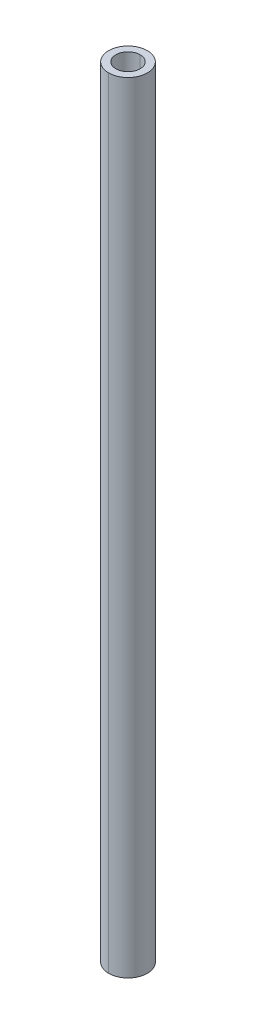
ISO-10303-21;
HEADER;
FILE_DESCRIPTION(('STEP AP214'),'2;1');
FILE_NAME('part.step','',(''),(''),'','','');
FILE_SCHEMA(('AUTOMOTIVE_DESIGN { 1 0 10303 214 1 1 1 1 }'));
ENDSEC;
DATA;
#1=APPLICATION_CONTEXT('core data for automotive mechanical design processes');
#2=APPLICATION_PROTOCOL_DEFINITION('international standard','automotive_design',2000,#1);
#3=PRODUCT_CONTEXT('',#1,'mechanical');
#4=PRODUCT('Part','Part','',(#3));
#5=PRODUCT_RELATED_PRODUCT_CATEGORY('part','',(#4));
#6=PRODUCT_DEFINITION_FORMATION('','',#4);
#7=PRODUCT_DEFINITION_CONTEXT('part definition',#1,'design');
#8=PRODUCT_DEFINITION('design','',#6,#7);
#9=PRODUCT_DEFINITION_SHAPE('','',#8);
#10=(LENGTH_UNIT() NAMED_UNIT(*) SI_UNIT(.MILLI.,.METRE.));
#11=(NAMED_UNIT(*) PLANE_ANGLE_UNIT() SI_UNIT($,.RADIAN.));
#12=(NAMED_UNIT(*) SI_UNIT($,.STERADIAN.) SOLID_ANGLE_UNIT());
#13=UNCERTAINTY_MEASURE_WITH_UNIT(LENGTH_MEASURE(1.E-05),#10,'distance_accuracy_value','');
#14=(GEOMETRIC_REPRESENTATION_CONTEXT(3) GLOBAL_UNCERTAINTY_ASSIGNED_CONTEXT((#13)) GLOBAL_UNIT_ASSIGNED_CONTEXT((#10,
#11,#12)) REPRESENTATION_CONTEXT('',''));
#15=CARTESIAN_POINT('',(0.,0.,0.));
#16=DIRECTION('',(0.,0.,1.));
#17=DIRECTION('',(1.,0.,0.));
#18=AXIS2_PLACEMENT_3D('',#15,#16,#17);
#19=CARTESIAN_POINT('',(0.,120.,0.));
#20=DIRECTION('',(0.,-1.,0.));
#21=DIRECTION('',(0.,0.,-1.));
#22=AXIS2_PLACEMENT_3D('',#19,#20,#21);
#23=CYLINDRICAL_SURFACE('',#22,1.875);
#24=DIRECTION('',(0.,-1.,0.));
#25=VECTOR('',#24,1.);
#26=CARTESIAN_POINT('',(0.,120.,1.875));
#27=LINE('',#26,#25);
#28=CARTESIAN_POINT('',(0.,120.,1.875));
#29=VERTEX_POINT('',#28);
#30=CARTESIAN_POINT('',(0.,0.,1.875));
#31=VERTEX_POINT('',#30);
#32=EDGE_CURVE('E83',#29,#31,#27,.T.);
#33=ORIENTED_EDGE('',*,*,#32,.F.);
#34=CARTESIAN_POINT('',(0.,120.,0.));
#35=DIRECTION('',(0.,1.,0.));
#36=DIRECTION('',(0.,0.,1.));
#37=AXIS2_PLACEMENT_3D('',#34,#35,#36);
#38=CIRCLE('',#37,1.875);
#39=CARTESIAN_POINT('',(0.,120.,-1.875));
#40=VERTEX_POINT('',#39);
#41=EDGE_CURVE('E73',#29,#40,#38,.T.);
#42=ORIENTED_EDGE('',*,*,#41,.T.);
#43=DIRECTION('',(0.,-1.,0.));
#44=VECTOR('',#43,1.);
#45=CARTESIAN_POINT('',(0.,120.,-1.875));
#46=LINE('',#45,#44);
#47=CARTESIAN_POINT('',(0.,0.,-1.875));
#48=VERTEX_POINT('',#47);
#49=EDGE_CURVE('E86',#40,#48,#46,.T.);
#50=ORIENTED_EDGE('',*,*,#49,.T.);
#51=CARTESIAN_POINT('',(0.,0.,0.));
#52=DIRECTION('',(0.,1.,0.));
#53=DIRECTION('',(0.,0.,1.));
#54=AXIS2_PLACEMENT_3D('',#51,#52,#53);
#55=CIRCLE('',#54,1.875);
#56=EDGE_CURVE('E11',#31,#48,#55,.T.);
#57=ORIENTED_EDGE('',*,*,#56,.F.);
#58=EDGE_LOOP('',(#33,#42,#50,#57));
#59=FACE_BOUND('',#58,.T.);
#60=ADVANCED_FACE('F19',(#59),#23,.F.);
#61=CARTESIAN_POINT('',(0.,120.,0.));
#62=DIRECTION('',(0.,-1.,0.));
#63=DIRECTION('',(0.,0.,-1.));
#64=AXIS2_PLACEMENT_3D('',#61,#62,#63);
#65=CYLINDRICAL_SURFACE('',#64,2.975);
#66=DIRECTION('',(0.,-1.,0.));
#67=VECTOR('',#66,1.);
#68=CARTESIAN_POINT('',(0.,120.,2.975));
#69=LINE('',#68,#67);
#70=CARTESIAN_POINT('',(0.,120.,2.975));
#71=VERTEX_POINT('',#70);
#72=CARTESIAN_POINT('',(0.,0.,2.975));
#73=VERTEX_POINT('',#72);
#74=EDGE_CURVE('E107',#71,#73,#69,.T.);
#75=ORIENTED_EDGE('',*,*,#74,.F.);
#76=CARTESIAN_POINT('',(0.,120.,0.));
#77=DIRECTION('',(0.,1.,0.));
#78=DIRECTION('',(0.,0.,1.));
#79=AXIS2_PLACEMENT_3D('',#76,#77,#78);
#80=CIRCLE('',#79,2.975);
#81=CARTESIAN_POINT('',(0.,120.,-2.975));
#82=VERTEX_POINT('',#81);
#83=EDGE_CURVE('E112',#82,#71,#80,.T.);
#84=ORIENTED_EDGE('',*,*,#83,.F.);
#85=DIRECTION('',(0.,-1.,0.));
#86=VECTOR('',#85,1.);
#87=CARTESIAN_POINT('',(0.,120.,-2.975));
#88=LINE('',#87,#86);
#89=CARTESIAN_POINT('',(0.,0.,-2.975));
#90=VERTEX_POINT('',#89);
#91=EDGE_CURVE('E117',#82,#90,#88,.T.);
#92=ORIENTED_EDGE('',*,*,#91,.T.);
#93=CARTESIAN_POINT('',(0.,0.,0.));
#94=DIRECTION('',(0.,1.,0.));
#95=DIRECTION('',(0.,0.,1.));
#96=AXIS2_PLACEMENT_3D('',#93,#94,#95);
#97=CIRCLE('',#96,2.975);
#98=EDGE_CURVE('E29',#90,#73,#97,.T.);
#99=ORIENTED_EDGE('',*,*,#98,.T.);
#100=EDGE_LOOP('',(#75,#84,#92,#99));
#101=FACE_BOUND('',#100,.T.);
#102=ADVANCED_FACE('F128',(#101),#65,.T.);
#103=CARTESIAN_POINT('',(0.,0.,0.));
#104=DIRECTION('',(0.,1.,0.));
#105=DIRECTION('',(1.,0.,0.));
#106=AXIS2_PLACEMENT_3D('',#103,#104,#105);
#107=PLANE('',#106);
#108=CARTESIAN_POINT('',(0.,0.,0.));
#109=DIRECTION('',(0.,1.,0.));
#110=DIRECTION('',(0.,0.,1.));
#111=AXIS2_PLACEMENT_3D('',#108,#109,#110);
#112=CIRCLE('',#111,1.875);
#113=EDGE_CURVE('E89',#48,#31,#112,.T.);
#114=ORIENTED_EDGE('',*,*,#113,.T.);
#115=ORIENTED_EDGE('',*,*,#56,.T.);
#116=EDGE_LOOP('',(#114,#115));
#117=FACE_BOUND('',#116,.T.);
#118=ORIENTED_EDGE('',*,*,#98,.F.);
#119=CARTESIAN_POINT('',(0.,0.,0.));
#120=DIRECTION('',(0.,1.,0.));
#121=DIRECTION('',(0.,0.,1.));
#122=AXIS2_PLACEMENT_3D('',#119,#120,#121);
#123=CIRCLE('',#122,2.975);
#124=EDGE_CURVE('E121',#73,#90,#123,.T.);
#125=ORIENTED_EDGE('',*,*,#124,.F.);
#126=EDGE_LOOP('',(#118,#125));
#127=FACE_BOUND('',#126,.T.);
#128=ADVANCED_FACE('F90',(#117,#127),#107,.F.);
#129=CARTESIAN_POINT('',(0.,120.,0.));
#130=DIRECTION('',(0.,1.,0.));
#131=DIRECTION('',(1.,0.,0.));
#132=AXIS2_PLACEMENT_3D('',#129,#130,#131);
#133=PLANE('',#132);
#134=CARTESIAN_POINT('',(0.,120.,0.));
#135=DIRECTION('',(0.,1.,0.));
#136=DIRECTION('',(0.,0.,1.));
#137=AXIS2_PLACEMENT_3D('',#134,#135,#136);
#138=CIRCLE('',#137,1.875);
#139=EDGE_CURVE('E23',#40,#29,#138,.T.);
#140=ORIENTED_EDGE('',*,*,#139,.F.);
#141=ORIENTED_EDGE('',*,*,#41,.F.);
#142=EDGE_LOOP('',(#140,#141));
#143=FACE_BOUND('',#142,.T.);
#144=ORIENTED_EDGE('',*,*,#83,.T.);
#145=CARTESIAN_POINT('',(0.,120.,0.));
#146=DIRECTION('',(0.,1.,0.));
#147=DIRECTION('',(0.,0.,1.));
#148=AXIS2_PLACEMENT_3D('',#145,#146,#147);
#149=CIRCLE('',#148,2.975);
#150=EDGE_CURVE('E104',#71,#82,#149,.T.);
#151=ORIENTED_EDGE('',*,*,#150,.T.);
#152=EDGE_LOOP('',(#144,#151));
#153=FACE_BOUND('',#152,.T.);
#154=ADVANCED_FACE('F21',(#143,#153),#133,.T.);
#155=CARTESIAN_POINT('',(0.,120.,0.));
#156=DIRECTION('',(0.,-1.,0.));
#157=DIRECTION('',(0.,0.,-1.));
#158=AXIS2_PLACEMENT_3D('',#155,#156,#157);
#159=CYLINDRICAL_SURFACE('',#158,2.975);
#160=ORIENTED_EDGE('',*,*,#150,.F.);
#161=ORIENTED_EDGE('',*,*,#74,.T.);
#162=ORIENTED_EDGE('',*,*,#124,.T.);
#163=ORIENTED_EDGE('',*,*,#91,.F.);
#164=EDGE_LOOP('',(#160,#161,#162,#163));
#165=FACE_BOUND('',#164,.T.);
#166=ADVANCED_FACE('F132',(#165),#159,.T.);
#167=CARTESIAN_POINT('',(0.,120.,0.));
#168=DIRECTION('',(0.,-1.,0.));
#169=DIRECTION('',(0.,0.,-1.));
#170=AXIS2_PLACEMENT_3D('',#167,#168,#169);
#171=CYLINDRICAL_SURFACE('',#170,1.875);
#172=ORIENTED_EDGE('',*,*,#139,.T.);
#173=ORIENTED_EDGE('',*,*,#32,.T.);
#174=ORIENTED_EDGE('',*,*,#113,.F.);
#175=ORIENTED_EDGE('',*,*,#49,.F.);
#176=EDGE_LOOP('',(#172,#173,#174,#175));
#177=FACE_BOUND('',#176,.T.);
#178=ADVANCED_FACE('F94',(#177),#171,.F.);
#179=CLOSED_SHELL('',(#60,#102,#128,#154,#166,#178));
#180=MANIFOLD_SOLID_BREP('B1',#179);
#181=ADVANCED_BREP_SHAPE_REPRESENTATION('',(#18,#180),#14);
#182=SHAPE_DEFINITION_REPRESENTATION(#9,#181);
ENDSEC;
END-ISO-10303-21;
